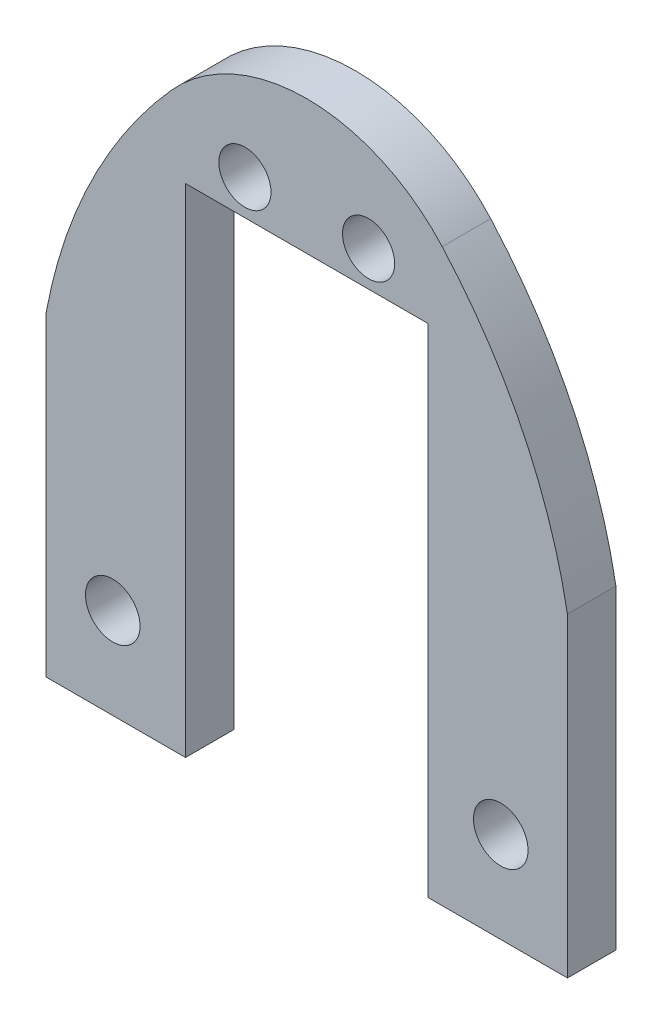
ISO-10303-21;
HEADER;
FILE_DESCRIPTION(('STEP AP214'),'2;1');
FILE_NAME('part.step','',(''),(''),'','','');
FILE_SCHEMA(('AUTOMOTIVE_DESIGN { 1 0 10303 214 1 1 1 1 }'));
ENDSEC;
DATA;
#1=APPLICATION_CONTEXT('core data for automotive mechanical design processes');
#2=APPLICATION_PROTOCOL_DEFINITION('international standard','automotive_design',2000,#1);
#3=PRODUCT_CONTEXT('',#1,'mechanical');
#4=PRODUCT('Part','Part','',(#3));
#5=PRODUCT_RELATED_PRODUCT_CATEGORY('part','',(#4));
#6=PRODUCT_DEFINITION_FORMATION('','',#4);
#7=PRODUCT_DEFINITION_CONTEXT('part definition',#1,'design');
#8=PRODUCT_DEFINITION('design','',#6,#7);
#9=PRODUCT_DEFINITION_SHAPE('','',#8);
#10=(LENGTH_UNIT() NAMED_UNIT(*) SI_UNIT(.MILLI.,.METRE.));
#11=(NAMED_UNIT(*) PLANE_ANGLE_UNIT() SI_UNIT($,.RADIAN.));
#12=(NAMED_UNIT(*) SI_UNIT($,.STERADIAN.) SOLID_ANGLE_UNIT());
#13=UNCERTAINTY_MEASURE_WITH_UNIT(LENGTH_MEASURE(1.E-05),#10,'distance_accuracy_value','');
#14=(GEOMETRIC_REPRESENTATION_CONTEXT(3) GLOBAL_UNCERTAINTY_ASSIGNED_CONTEXT((#13)) GLOBAL_UNIT_ASSIGNED_CONTEXT((#10,
#11,#12)) REPRESENTATION_CONTEXT('',''));
#15=CARTESIAN_POINT('',(0.,0.,0.));
#16=DIRECTION('',(0.,0.,1.));
#17=DIRECTION('',(1.,0.,0.));
#18=AXIS2_PLACEMENT_3D('',#15,#16,#17);
#19=CARTESIAN_POINT('',(0.,0.,4.));
#20=DIRECTION('',(0.,0.,1.));
#21=DIRECTION('',(1.,0.,0.));
#22=AXIS2_PLACEMENT_3D('',#19,#20,#21);
#23=PLANE('',#22);
#24=CARTESIAN_POINT('',(-37.5,7.50000000000004,4.));
#25=DIRECTION('',(0.,0.,-1.));
#26=DIRECTION('',(-1.,0.,0.));
#27=AXIS2_PLACEMENT_3D('',#24,#25,#26);
#28=CIRCLE('',#27,2.25);
#29=CARTESIAN_POINT('',(-39.75,7.50000000000004,4.));
#30=VERTEX_POINT('',#29);
#31=EDGE_CURVE('E214',#30,#30,#28,.T.);
#32=ORIENTED_EDGE('',*,*,#31,.T.);
#33=EDGE_LOOP('',(#32));
#34=FACE_BOUND('',#33,.T.);
#35=CARTESIAN_POINT('',(-5.50000000000005,7.50000000000004,4.));
#36=DIRECTION('',(0.,0.,-1.));
#37=DIRECTION('',(1.,0.,0.));
#38=AXIS2_PLACEMENT_3D('',#35,#36,#37);
#39=CIRCLE('',#38,2.25);
#40=CARTESIAN_POINT('',(-3.25000000000005,7.50000000000004,4.));
#41=VERTEX_POINT('',#40);
#42=EDGE_CURVE('E384',#41,#41,#39,.T.);
#43=ORIENTED_EDGE('',*,*,#42,.T.);
#44=EDGE_LOOP('',(#43));
#45=FACE_BOUND('',#44,.T.);
#46=CARTESIAN_POINT('',(-26.6,43.9,4.));
#47=DIRECTION('',(0.,0.,1.));
#48=DIRECTION('',(1.,0.,0.));
#49=AXIS2_PLACEMENT_3D('',#46,#47,#48);
#50=CIRCLE('',#49,2.15);
#51=CARTESIAN_POINT('',(-24.45,43.9,4.));
#52=VERTEX_POINT('',#51);
#53=EDGE_CURVE('E221',#52,#52,#50,.T.);
#54=ORIENTED_EDGE('',*,*,#53,.F.);
#55=EDGE_LOOP('',(#54));
#56=FACE_BOUND('',#55,.T.);
#57=CARTESIAN_POINT('',(-16.4,43.9,4.));
#58=DIRECTION('',(0.,0.,1.));
#59=DIRECTION('',(1.,0.,0.));
#60=AXIS2_PLACEMENT_3D('',#57,#58,#59);
#61=CIRCLE('',#60,2.15);
#62=CARTESIAN_POINT('',(-14.25,43.9,4.));
#63=VERTEX_POINT('',#62);
#64=EDGE_CURVE('E134',#63,#63,#61,.T.);
#65=ORIENTED_EDGE('',*,*,#64,.F.);
#66=EDGE_LOOP('',(#65));
#67=FACE_BOUND('',#66,.T.);
#68=CARTESIAN_POINT('',(-0.471292777228093,18.2252598236801,4.));
#69=DIRECTION('',(0.,0.,-1.));
#70=DIRECTION('',(-1.,0.,0.));
#71=AXIS2_PLACEMENT_3D('',#68,#69,#70);
#72=CIRCLE('',#71,43.233523137139);
#73=CARTESIAN_POINT('',(-43.,26.,4.));
#74=VERTEX_POINT('',#73);
#75=CARTESIAN_POINT('',(-32.672201457446,47.0738126993064,4.));
#76=VERTEX_POINT('',#75);
#77=EDGE_CURVE('E172',#74,#76,#72,.T.);
#78=ORIENTED_EDGE('',*,*,#77,.F.);
#79=DIRECTION('',(0.,-1.,0.));
#80=VECTOR('',#79,1.);
#81=CARTESIAN_POINT('',(-43.,41.,4.));
#82=LINE('',#81,#80);
#83=CARTESIAN_POINT('',(-43.,0.,4.));
#84=VERTEX_POINT('',#83);
#85=EDGE_CURVE('E164',#74,#84,#82,.T.);
#86=ORIENTED_EDGE('',*,*,#85,.T.);
#87=DIRECTION('',(1.,0.,0.));
#88=VECTOR('',#87,1.);
#89=CARTESIAN_POINT('',(-43.,0.,4.));
#90=LINE('',#89,#88);
#91=CARTESIAN_POINT('',(-31.5,0.,4.));
#92=VERTEX_POINT('',#91);
#93=EDGE_CURVE('E109',#84,#92,#90,.T.);
#94=ORIENTED_EDGE('',*,*,#93,.T.);
#95=DIRECTION('',(0.,1.,0.));
#96=VECTOR('',#95,1.);
#97=CARTESIAN_POINT('',(-31.5,0.,4.));
#98=LINE('',#97,#96);
#99=CARTESIAN_POINT('',(-31.5,41.,4.));
#100=VERTEX_POINT('',#99);
#101=EDGE_CURVE('E102',#92,#100,#98,.T.);
#102=ORIENTED_EDGE('',*,*,#101,.T.);
#103=DIRECTION('',(1.,0.,0.));
#104=VECTOR('',#103,1.);
#105=CARTESIAN_POINT('',(-31.5,41.,4.));
#106=LINE('',#105,#104);
#107=CARTESIAN_POINT('',(-11.5,41.,4.));
#108=VERTEX_POINT('',#107);
#109=EDGE_CURVE('E106',#100,#108,#106,.T.);
#110=ORIENTED_EDGE('',*,*,#109,.T.);
#111=DIRECTION('',(0.,-1.,0.));
#112=VECTOR('',#111,1.);
#113=CARTESIAN_POINT('',(-11.5,41.,4.));
#114=LINE('',#113,#112);
#115=CARTESIAN_POINT('',(-11.5,0.,4.));
#116=VERTEX_POINT('',#115);
#117=EDGE_CURVE('E56',#108,#116,#114,.T.);
#118=ORIENTED_EDGE('',*,*,#117,.T.);
#119=DIRECTION('',(1.,0.,0.));
#120=VECTOR('',#119,1.);
#121=CARTESIAN_POINT('',(-11.5,0.,4.));
#122=LINE('',#121,#120);
#123=CARTESIAN_POINT('',(0.,0.,4.));
#124=VERTEX_POINT('',#123);
#125=EDGE_CURVE('E145',#116,#124,#122,.T.);
#126=ORIENTED_EDGE('',*,*,#125,.T.);
#127=DIRECTION('',(0.,1.,0.));
#128=VECTOR('',#127,1.);
#129=CARTESIAN_POINT('',(0.,0.,4.));
#130=LINE('',#129,#128);
#131=CARTESIAN_POINT('',(0.,26.,4.));
#132=VERTEX_POINT('',#131);
#133=EDGE_CURVE('E91',#124,#132,#130,.T.);
#134=ORIENTED_EDGE('',*,*,#133,.T.);
#135=CARTESIAN_POINT('',(-42.5287072227719,18.2252598236801,4.));
#136=DIRECTION('',(0.,0.,-1.));
#137=DIRECTION('',(1.,0.,0.));
#138=AXIS2_PLACEMENT_3D('',#135,#136,#137);
#139=CIRCLE('',#138,43.233523137139);
#140=CARTESIAN_POINT('',(-10.3277985425541,47.0738126993064,4.));
#141=VERTEX_POINT('',#140);
#142=EDGE_CURVE('E185',#141,#132,#139,.T.);
#143=ORIENTED_EDGE('',*,*,#142,.F.);
#144=CARTESIAN_POINT('',(-21.5,37.0647211024509,4.));
#145=DIRECTION('',(0.,0.,-1.));
#146=DIRECTION('',(-1.,0.,0.));
#147=AXIS2_PLACEMENT_3D('',#144,#145,#146);
#148=CIRCLE('',#147,15.);
#149=EDGE_CURVE('E201',#76,#141,#148,.T.);
#150=ORIENTED_EDGE('',*,*,#149,.F.);
#151=EDGE_LOOP('',(#78,#86,#94,#102,#110,#118,#126,#134,#143,#150));
#152=FACE_BOUND('',#151,.T.);
#153=ADVANCED_FACE('F32',(#34,#45,#56,#67,#152),#23,.T.);
#154=CARTESIAN_POINT('',(0.,0.,0.));
#155=DIRECTION('',(0.,0.,1.));
#156=DIRECTION('',(1.,0.,0.));
#157=AXIS2_PLACEMENT_3D('',#154,#155,#156);
#158=PLANE('',#157);
#159=CARTESIAN_POINT('',(-37.5,7.50000000000004,0.));
#160=DIRECTION('',(0.,0.,-1.));
#161=DIRECTION('',(-1.,0.,0.));
#162=AXIS2_PLACEMENT_3D('',#159,#160,#161);
#163=CIRCLE('',#162,2.25);
#164=CARTESIAN_POINT('',(-39.75,7.50000000000004,0.));
#165=VERTEX_POINT('',#164);
#166=EDGE_CURVE('E381',#165,#165,#163,.T.);
#167=ORIENTED_EDGE('',*,*,#166,.F.);
#168=EDGE_LOOP('',(#167));
#169=FACE_BOUND('',#168,.T.);
#170=CARTESIAN_POINT('',(-5.50000000000005,7.50000000000004,0.));
#171=DIRECTION('',(0.,0.,-1.));
#172=DIRECTION('',(1.,0.,0.));
#173=AXIS2_PLACEMENT_3D('',#170,#171,#172);
#174=CIRCLE('',#173,2.25);
#175=CARTESIAN_POINT('',(-3.25000000000005,7.50000000000004,0.));
#176=VERTEX_POINT('',#175);
#177=EDGE_CURVE('E388',#176,#176,#174,.T.);
#178=ORIENTED_EDGE('',*,*,#177,.F.);
#179=EDGE_LOOP('',(#178));
#180=FACE_BOUND('',#179,.T.);
#181=CARTESIAN_POINT('',(-16.4,43.9,0.));
#182=DIRECTION('',(0.,0.,1.));
#183=DIRECTION('',(1.,0.,0.));
#184=AXIS2_PLACEMENT_3D('',#181,#182,#183);
#185=CIRCLE('',#184,2.15);
#186=CARTESIAN_POINT('',(-14.25,43.9,0.));
#187=VERTEX_POINT('',#186);
#188=EDGE_CURVE('E167',#187,#187,#185,.T.);
#189=ORIENTED_EDGE('',*,*,#188,.T.);
#190=EDGE_LOOP('',(#189));
#191=FACE_BOUND('',#190,.T.);
#192=CARTESIAN_POINT('',(-26.6,43.9,0.));
#193=DIRECTION('',(0.,0.,1.));
#194=DIRECTION('',(1.,0.,0.));
#195=AXIS2_PLACEMENT_3D('',#192,#193,#194);
#196=CIRCLE('',#195,2.15);
#197=CARTESIAN_POINT('',(-24.45,43.9,0.));
#198=VERTEX_POINT('',#197);
#199=EDGE_CURVE('E218',#198,#198,#196,.T.);
#200=ORIENTED_EDGE('',*,*,#199,.T.);
#201=EDGE_LOOP('',(#200));
#202=FACE_BOUND('',#201,.T.);
#203=DIRECTION('',(0.,-1.,0.));
#204=VECTOR('',#203,1.);
#205=CARTESIAN_POINT('',(-43.,41.,0.));
#206=LINE('',#205,#204);
#207=CARTESIAN_POINT('',(-43.,26.,0.));
#208=VERTEX_POINT('',#207);
#209=CARTESIAN_POINT('',(-43.,0.,0.));
#210=VERTEX_POINT('',#209);
#211=EDGE_CURVE('E137',#208,#210,#206,.T.);
#212=ORIENTED_EDGE('',*,*,#211,.F.);
#213=CARTESIAN_POINT('',(-0.471292777228093,18.2252598236801,0.));
#214=DIRECTION('',(0.,0.,-1.));
#215=DIRECTION('',(-1.,0.,0.));
#216=AXIS2_PLACEMENT_3D('',#213,#214,#215);
#217=CIRCLE('',#216,43.233523137139);
#218=CARTESIAN_POINT('',(-32.672201457446,47.0738126993064,0.));
#219=VERTEX_POINT('',#218);
#220=EDGE_CURVE('E47',#208,#219,#217,.T.);
#221=ORIENTED_EDGE('',*,*,#220,.T.);
#222=CARTESIAN_POINT('',(-21.5,37.0647211024509,0.));
#223=DIRECTION('',(0.,0.,-1.));
#224=DIRECTION('',(-1.,0.,0.));
#225=AXIS2_PLACEMENT_3D('',#222,#223,#224);
#226=CIRCLE('',#225,15.);
#227=CARTESIAN_POINT('',(-10.3277985425541,47.0738126993064,0.));
#228=VERTEX_POINT('',#227);
#229=EDGE_CURVE('E200',#219,#228,#226,.T.);
#230=ORIENTED_EDGE('',*,*,#229,.T.);
#231=CARTESIAN_POINT('',(-42.5287072227719,18.2252598236801,0.));
#232=DIRECTION('',(0.,0.,-1.));
#233=DIRECTION('',(1.,0.,0.));
#234=AXIS2_PLACEMENT_3D('',#231,#232,#233);
#235=CIRCLE('',#234,43.233523137139);
#236=CARTESIAN_POINT('',(0.,26.,0.));
#237=VERTEX_POINT('',#236);
#238=EDGE_CURVE('E206',#228,#237,#235,.T.);
#239=ORIENTED_EDGE('',*,*,#238,.T.);
#240=DIRECTION('',(0.,1.,0.));
#241=VECTOR('',#240,1.);
#242=CARTESIAN_POINT('',(0.,0.,0.));
#243=LINE('',#242,#241);
#244=CARTESIAN_POINT('',(0.,0.,0.));
#245=VERTEX_POINT('',#244);
#246=EDGE_CURVE('E133',#245,#237,#243,.T.);
#247=ORIENTED_EDGE('',*,*,#246,.F.);
#248=DIRECTION('',(1.,0.,0.));
#249=VECTOR('',#248,1.);
#250=CARTESIAN_POINT('',(-11.5,0.,0.));
#251=LINE('',#250,#249);
#252=CARTESIAN_POINT('',(-11.5,0.,0.));
#253=VERTEX_POINT('',#252);
#254=EDGE_CURVE('E130',#253,#245,#251,.T.);
#255=ORIENTED_EDGE('',*,*,#254,.F.);
#256=DIRECTION('',(0.,-1.,0.));
#257=VECTOR('',#256,1.);
#258=CARTESIAN_POINT('',(-11.5,41.,0.));
#259=LINE('',#258,#257);
#260=CARTESIAN_POINT('',(-11.5,41.,0.));
#261=VERTEX_POINT('',#260);
#262=EDGE_CURVE('E83',#261,#253,#259,.T.);
#263=ORIENTED_EDGE('',*,*,#262,.F.);
#264=DIRECTION('',(1.,0.,0.));
#265=VECTOR('',#264,1.);
#266=CARTESIAN_POINT('',(-31.5,41.,0.));
#267=LINE('',#266,#265);
#268=CARTESIAN_POINT('',(-31.5,41.,0.));
#269=VERTEX_POINT('',#268);
#270=EDGE_CURVE('E142',#269,#261,#267,.T.);
#271=ORIENTED_EDGE('',*,*,#270,.F.);
#272=DIRECTION('',(0.,1.,0.));
#273=VECTOR('',#272,1.);
#274=CARTESIAN_POINT('',(-31.5,0.,0.));
#275=LINE('',#274,#273);
#276=CARTESIAN_POINT('',(-31.5,0.,0.));
#277=VERTEX_POINT('',#276);
#278=EDGE_CURVE('E118',#277,#269,#275,.T.);
#279=ORIENTED_EDGE('',*,*,#278,.F.);
#280=DIRECTION('',(1.,0.,0.));
#281=VECTOR('',#280,1.);
#282=CARTESIAN_POINT('',(-43.,0.,0.));
#283=LINE('',#282,#281);
#284=EDGE_CURVE('E139',#210,#277,#283,.T.);
#285=ORIENTED_EDGE('',*,*,#284,.F.);
#286=EDGE_LOOP('',(#212,#221,#230,#239,#247,#255,#263,#271,#279,#285));
#287=FACE_BOUND('',#286,.T.);
#288=ADVANCED_FACE('F157',(#169,#180,#191,#202,#287),#158,.F.);
#289=CARTESIAN_POINT('',(-11.5,0.,4.));
#290=DIRECTION('',(0.,1.,0.));
#291=DIRECTION('',(0.,0.,1.));
#292=AXIS2_PLACEMENT_3D('',#289,#290,#291);
#293=PLANE('',#292);
#294=ORIENTED_EDGE('',*,*,#254,.T.);
#295=DIRECTION('',(0.,0.,-1.));
#296=VECTOR('',#295,1.);
#297=CARTESIAN_POINT('',(0.,0.,4.));
#298=LINE('',#297,#296);
#299=EDGE_CURVE('E11',#124,#245,#298,.T.);
#300=ORIENTED_EDGE('',*,*,#299,.F.);
#301=ORIENTED_EDGE('',*,*,#125,.F.);
#302=DIRECTION('',(0.,0.,-1.));
#303=VECTOR('',#302,1.);
#304=CARTESIAN_POINT('',(-11.5,0.,4.));
#305=LINE('',#304,#303);
#306=EDGE_CURVE('E126',#116,#253,#305,.T.);
#307=ORIENTED_EDGE('',*,*,#306,.T.);
#308=EDGE_LOOP('',(#294,#300,#301,#307));
#309=FACE_BOUND('',#308,.T.);
#310=ADVANCED_FACE('F34',(#309),#293,.F.);
#311=CARTESIAN_POINT('',(0.,0.,4.));
#312=DIRECTION('',(-1.,0.,0.));
#313=DIRECTION('',(0.,0.,1.));
#314=AXIS2_PLACEMENT_3D('',#311,#312,#313);
#315=PLANE('',#314);
#316=ORIENTED_EDGE('',*,*,#246,.T.);
#317=DIRECTION('',(0.,0.,1.));
#318=VECTOR('',#317,1.);
#319=CARTESIAN_POINT('',(0.,26.,0.));
#320=LINE('',#319,#318);
#321=EDGE_CURVE('E202',#237,#132,#320,.T.);
#322=ORIENTED_EDGE('',*,*,#321,.T.);
#323=ORIENTED_EDGE('',*,*,#133,.F.);
#324=ORIENTED_EDGE('',*,*,#299,.T.);
#325=EDGE_LOOP('',(#316,#322,#323,#324));
#326=FACE_BOUND('',#325,.T.);
#327=ADVANCED_FACE('F263',(#326),#315,.F.);
#328=CARTESIAN_POINT('',(-43.,41.,4.));
#329=DIRECTION('',(1.,0.,0.));
#330=DIRECTION('',(0.,1.,0.));
#331=AXIS2_PLACEMENT_3D('',#328,#329,#330);
#332=PLANE('',#331);
#333=ORIENTED_EDGE('',*,*,#85,.F.);
#334=DIRECTION('',(0.,0.,1.));
#335=VECTOR('',#334,1.);
#336=CARTESIAN_POINT('',(-43.,26.,0.));
#337=LINE('',#336,#335);
#338=EDGE_CURVE('E174',#208,#74,#337,.T.);
#339=ORIENTED_EDGE('',*,*,#338,.F.);
#340=ORIENTED_EDGE('',*,*,#211,.T.);
#341=DIRECTION('',(0.,0.,-1.));
#342=VECTOR('',#341,1.);
#343=CARTESIAN_POINT('',(-43.,0.,4.));
#344=LINE('',#343,#342);
#345=EDGE_CURVE('E40',#84,#210,#344,.T.);
#346=ORIENTED_EDGE('',*,*,#345,.F.);
#347=EDGE_LOOP('',(#333,#339,#340,#346));
#348=FACE_BOUND('',#347,.T.);
#349=ADVANCED_FACE('F173',(#348),#332,.F.);
#350=CARTESIAN_POINT('',(-43.,0.,4.));
#351=DIRECTION('',(0.,1.,0.));
#352=DIRECTION('',(0.,0.,1.));
#353=AXIS2_PLACEMENT_3D('',#350,#351,#352);
#354=PLANE('',#353);
#355=ORIENTED_EDGE('',*,*,#284,.T.);
#356=DIRECTION('',(0.,0.,-1.));
#357=VECTOR('',#356,1.);
#358=CARTESIAN_POINT('',(-31.5,0.,4.));
#359=LINE('',#358,#357);
#360=EDGE_CURVE('E121',#92,#277,#359,.T.);
#361=ORIENTED_EDGE('',*,*,#360,.F.);
#362=ORIENTED_EDGE('',*,*,#93,.F.);
#363=ORIENTED_EDGE('',*,*,#345,.T.);
#364=EDGE_LOOP('',(#355,#361,#362,#363));
#365=FACE_BOUND('',#364,.T.);
#366=ADVANCED_FACE('F152',(#365),#354,.F.);
#367=CARTESIAN_POINT('',(-31.5,0.,4.));
#368=DIRECTION('',(-1.,0.,0.));
#369=DIRECTION('',(0.,0.,1.));
#370=AXIS2_PLACEMENT_3D('',#367,#368,#369);
#371=PLANE('',#370);
#372=ORIENTED_EDGE('',*,*,#278,.T.);
#373=DIRECTION('',(0.,0.,-1.));
#374=VECTOR('',#373,1.);
#375=CARTESIAN_POINT('',(-31.5,41.,4.));
#376=LINE('',#375,#374);
#377=EDGE_CURVE('E115',#100,#269,#376,.T.);
#378=ORIENTED_EDGE('',*,*,#377,.F.);
#379=ORIENTED_EDGE('',*,*,#101,.F.);
#380=ORIENTED_EDGE('',*,*,#360,.T.);
#381=EDGE_LOOP('',(#372,#378,#379,#380));
#382=FACE_BOUND('',#381,.T.);
#383=ADVANCED_FACE('F116',(#382),#371,.F.);
#384=CARTESIAN_POINT('',(-31.5,41.,4.));
#385=DIRECTION('',(0.,1.,0.));
#386=DIRECTION('',(-1.,0.,0.));
#387=AXIS2_PLACEMENT_3D('',#384,#385,#386);
#388=PLANE('',#387);
#389=ORIENTED_EDGE('',*,*,#270,.T.);
#390=DIRECTION('',(0.,0.,-1.));
#391=VECTOR('',#390,1.);
#392=CARTESIAN_POINT('',(-11.5,41.,4.));
#393=LINE('',#392,#391);
#394=EDGE_CURVE('E122',#108,#261,#393,.T.);
#395=ORIENTED_EDGE('',*,*,#394,.F.);
#396=ORIENTED_EDGE('',*,*,#109,.F.);
#397=ORIENTED_EDGE('',*,*,#377,.T.);
#398=EDGE_LOOP('',(#389,#395,#396,#397));
#399=FACE_BOUND('',#398,.T.);
#400=ADVANCED_FACE('F124',(#399),#388,.F.);
#401=CARTESIAN_POINT('',(-11.5,41.,4.));
#402=DIRECTION('',(1.,0.,0.));
#403=DIRECTION('',(0.,1.,0.));
#404=AXIS2_PLACEMENT_3D('',#401,#402,#403);
#405=PLANE('',#404);
#406=ORIENTED_EDGE('',*,*,#262,.T.);
#407=ORIENTED_EDGE('',*,*,#306,.F.);
#408=ORIENTED_EDGE('',*,*,#117,.F.);
#409=ORIENTED_EDGE('',*,*,#394,.T.);
#410=EDGE_LOOP('',(#406,#407,#408,#409));
#411=FACE_BOUND('',#410,.T.);
#412=ADVANCED_FACE('F159',(#411),#405,.F.);
#413=CARTESIAN_POINT('',(-16.4,43.9,4.));
#414=DIRECTION('',(0.,0.,-1.));
#415=DIRECTION('',(-1.,0.,0.));
#416=AXIS2_PLACEMENT_3D('',#413,#414,#415);
#417=CYLINDRICAL_SURFACE('',#416,2.15);
#418=ORIENTED_EDGE('',*,*,#64,.T.);
#419=EDGE_LOOP('',(#418));
#420=FACE_BOUND('',#419,.T.);
#421=ORIENTED_EDGE('',*,*,#188,.F.);
#422=EDGE_LOOP('',(#421));
#423=FACE_BOUND('',#422,.T.);
#424=ADVANCED_FACE('F233',(#420,#423),#417,.F.);
#425=CARTESIAN_POINT('',(-26.6,43.9,4.));
#426=DIRECTION('',(0.,0.,-1.));
#427=DIRECTION('',(-1.,0.,0.));
#428=AXIS2_PLACEMENT_3D('',#425,#426,#427);
#429=CYLINDRICAL_SURFACE('',#428,2.15);
#430=ORIENTED_EDGE('',*,*,#53,.T.);
#431=EDGE_LOOP('',(#430));
#432=FACE_BOUND('',#431,.T.);
#433=ORIENTED_EDGE('',*,*,#199,.F.);
#434=EDGE_LOOP('',(#433));
#435=FACE_BOUND('',#434,.T.);
#436=ADVANCED_FACE('F235',(#432,#435),#429,.F.);
#437=CARTESIAN_POINT('',(-0.471292777228093,18.2252598236801,0.));
#438=DIRECTION('',(0.,0.,1.));
#439=DIRECTION('',(1.,0.,0.));
#440=AXIS2_PLACEMENT_3D('',#437,#438,#439);
#441=CYLINDRICAL_SURFACE('',#440,43.233523137139);
#442=ORIENTED_EDGE('',*,*,#77,.T.);
#443=DIRECTION('',(0.,0.,1.));
#444=VECTOR('',#443,1.);
#445=CARTESIAN_POINT('',(-32.672201457446,47.0738126993064,0.));
#446=LINE('',#445,#444);
#447=EDGE_CURVE('E203',#219,#76,#446,.T.);
#448=ORIENTED_EDGE('',*,*,#447,.F.);
#449=ORIENTED_EDGE('',*,*,#220,.F.);
#450=ORIENTED_EDGE('',*,*,#338,.T.);
#451=EDGE_LOOP('',(#442,#448,#449,#450));
#452=FACE_BOUND('',#451,.T.);
#453=ADVANCED_FACE('F241',(#452),#441,.T.);
#454=CARTESIAN_POINT('',(-42.5287072227719,18.2252598236801,0.));
#455=DIRECTION('',(0.,0.,1.));
#456=DIRECTION('',(1.,0.,0.));
#457=AXIS2_PLACEMENT_3D('',#454,#455,#456);
#458=CYLINDRICAL_SURFACE('',#457,43.233523137139);
#459=ORIENTED_EDGE('',*,*,#142,.T.);
#460=ORIENTED_EDGE('',*,*,#321,.F.);
#461=ORIENTED_EDGE('',*,*,#238,.F.);
#462=DIRECTION('',(0.,0.,1.));
#463=VECTOR('',#462,1.);
#464=CARTESIAN_POINT('',(-10.3277985425541,47.0738126993064,0.));
#465=LINE('',#464,#463);
#466=EDGE_CURVE('E196',#228,#141,#465,.T.);
#467=ORIENTED_EDGE('',*,*,#466,.T.);
#468=EDGE_LOOP('',(#459,#460,#461,#467));
#469=FACE_BOUND('',#468,.T.);
#470=ADVANCED_FACE('F207',(#469),#458,.T.);
#471=CARTESIAN_POINT('',(-21.5,37.0647211024509,0.));
#472=DIRECTION('',(0.,0.,1.));
#473=DIRECTION('',(1.,0.,0.));
#474=AXIS2_PLACEMENT_3D('',#471,#472,#473);
#475=CYLINDRICAL_SURFACE('',#474,15.);
#476=ORIENTED_EDGE('',*,*,#149,.T.);
#477=ORIENTED_EDGE('',*,*,#466,.F.);
#478=ORIENTED_EDGE('',*,*,#229,.F.);
#479=ORIENTED_EDGE('',*,*,#447,.T.);
#480=EDGE_LOOP('',(#476,#477,#478,#479));
#481=FACE_BOUND('',#480,.T.);
#482=ADVANCED_FACE('F198',(#481),#475,.T.);
#483=CARTESIAN_POINT('',(-5.50000000000005,7.50000000000004,4.));
#484=DIRECTION('',(0.,0.,-1.));
#485=DIRECTION('',(-1.,0.,0.));
#486=AXIS2_PLACEMENT_3D('',#483,#484,#485);
#487=CYLINDRICAL_SURFACE('',#486,2.25);
#488=ORIENTED_EDGE('',*,*,#177,.T.);
#489=EDGE_LOOP('',(#488));
#490=FACE_BOUND('',#489,.T.);
#491=ORIENTED_EDGE('',*,*,#42,.F.);
#492=EDGE_LOOP('',(#491));
#493=FACE_BOUND('',#492,.T.);
#494=ADVANCED_FACE('F284',(#490,#493),#487,.F.);
#495=CARTESIAN_POINT('',(-37.5,7.50000000000004,4.));
#496=DIRECTION('',(0.,0.,-1.));
#497=DIRECTION('',(-1.,0.,0.));
#498=AXIS2_PLACEMENT_3D('',#495,#496,#497);
#499=CYLINDRICAL_SURFACE('',#498,2.25);
#500=ORIENTED_EDGE('',*,*,#166,.T.);
#501=EDGE_LOOP('',(#500));
#502=FACE_BOUND('',#501,.T.);
#503=ORIENTED_EDGE('',*,*,#31,.F.);
#504=EDGE_LOOP('',(#503));
#505=FACE_BOUND('',#504,.T.);
#506=ADVANCED_FACE('F289',(#502,#505),#499,.F.);
#507=CLOSED_SHELL('',(#153,#288,#310,#327,#349,#366,#383,#400,#412,#424,#436,#453,#470,#482,
#494,#506));
#508=MANIFOLD_SOLID_BREP('B2',#507);
#509=ADVANCED_BREP_SHAPE_REPRESENTATION('',(#18,#508),#14);
#510=SHAPE_DEFINITION_REPRESENTATION(#9,#509);
ENDSEC;
END-ISO-10303-21;
